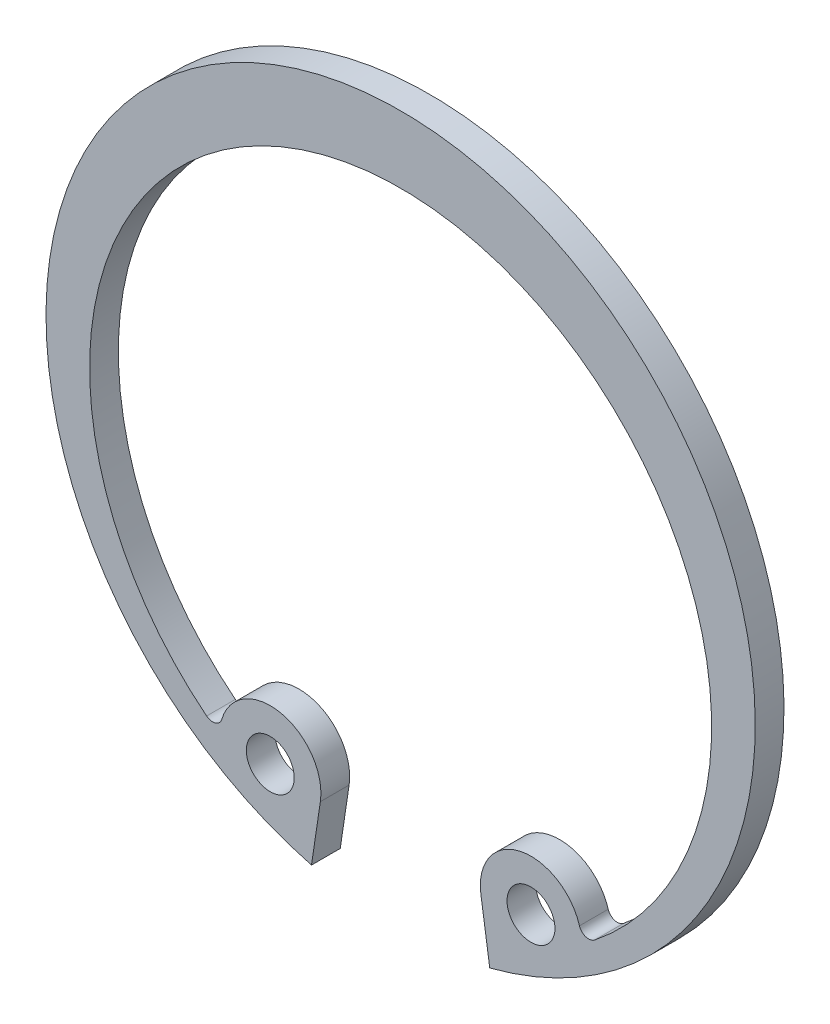
ISO-10303-21;
HEADER;
FILE_DESCRIPTION(('STEP AP214'),'2;1');
FILE_NAME('part.step','',(''),(''),'','','');
FILE_SCHEMA(('AUTOMOTIVE_DESIGN { 1 0 10303 214 1 1 1 1 }'));
ENDSEC;
DATA;
#1=APPLICATION_CONTEXT('core data for automotive mechanical design processes');
#2=APPLICATION_PROTOCOL_DEFINITION('international standard','automotive_design',2000,#1);
#3=PRODUCT_CONTEXT('',#1,'mechanical');
#4=PRODUCT('Part','Part','',(#3));
#5=PRODUCT_RELATED_PRODUCT_CATEGORY('part','',(#4));
#6=PRODUCT_DEFINITION_FORMATION('','',#4);
#7=PRODUCT_DEFINITION_CONTEXT('part definition',#1,'design');
#8=PRODUCT_DEFINITION('design','',#6,#7);
#9=PRODUCT_DEFINITION_SHAPE('','',#8);
#10=(LENGTH_UNIT() NAMED_UNIT(*) SI_UNIT(.MILLI.,.METRE.));
#11=(NAMED_UNIT(*) PLANE_ANGLE_UNIT() SI_UNIT($,.RADIAN.));
#12=(NAMED_UNIT(*) SI_UNIT($,.STERADIAN.) SOLID_ANGLE_UNIT());
#13=UNCERTAINTY_MEASURE_WITH_UNIT(LENGTH_MEASURE(1.E-05),#10,'distance_accuracy_value','');
#14=(GEOMETRIC_REPRESENTATION_CONTEXT(3) GLOBAL_UNCERTAINTY_ASSIGNED_CONTEXT((#13)) GLOBAL_UNIT_ASSIGNED_CONTEXT((#10,
#11,#12)) REPRESENTATION_CONTEXT('',''));
#15=CARTESIAN_POINT('',(0.,0.,0.));
#16=DIRECTION('',(0.,0.,1.));
#17=DIRECTION('',(1.,0.,0.));
#18=AXIS2_PLACEMENT_3D('',#15,#16,#17);
#19=CARTESIAN_POINT('',(-6.8,-14.4188102580849,1.5));
#20=DIRECTION('',(0.,0.,1.));
#21=DIRECTION('',(1.,0.,0.));
#22=AXIS2_PLACEMENT_3D('',#19,#20,#21);
#23=PLANE('',#22);
#24=CARTESIAN_POINT('',(-6.8,-14.4188102580849,1.5));
#25=DIRECTION('',(0.,0.,1.));
#26=DIRECTION('',(1.,0.,0.));
#27=AXIS2_PLACEMENT_3D('',#24,#25,#26);
#28=CIRCLE('',#27,1.25);
#29=CARTESIAN_POINT('',(-5.55,-14.4188102580849,1.5));
#30=VERTEX_POINT('',#29);
#31=EDGE_CURVE('E134',#30,#30,#28,.T.);
#32=ORIENTED_EDGE('',*,*,#31,.F.);
#33=EDGE_LOOP('',(#32));
#34=FACE_BOUND('',#33,.T.);
#35=CARTESIAN_POINT('',(-6.8,-14.4188102580849,1.5));
#36=DIRECTION('',(0.,0.,1.));
#37=DIRECTION('',(1.,0.,0.));
#38=AXIS2_PLACEMENT_3D('',#35,#36,#37);
#39=CIRCLE('',#38,2.64183456377138);
#40=CARTESIAN_POINT('',(-4.1871837080523,-14.8092982692578,1.5));
#41=VERTEX_POINT('',#40);
#42=CARTESIAN_POINT('',(-9.33028351823571,-13.6592346004433,1.5));
#43=VERTEX_POINT('',#42);
#44=EDGE_CURVE('E145',#41,#43,#39,.T.);
#45=ORIENTED_EDGE('',*,*,#44,.T.);
#46=CARTESIAN_POINT('',(-9.80917109752144,-13.5154754741039,1.5));
#47=DIRECTION('',(0.,0.,-1.));
#48=DIRECTION('',(1.,0.,0.));
#49=AXIS2_PLACEMENT_3D('',#46,#47,#48);
#50=CIRCLE('',#49,0.500000000000001);
#51=CARTESIAN_POINT('',(-10.1210684297161,-13.9062696068258,1.5));
#52=VERTEX_POINT('',#51);
#53=EDGE_CURVE('E93',#43,#52,#50,.T.);
#54=ORIENTED_EDGE('',*,*,#53,.T.);
#55=CARTESIAN_POINT('',(0.,-1.225,1.5));
#56=DIRECTION('',(0.,0.,-1.));
#57=DIRECTION('',(1.,0.,0.));
#58=AXIS2_PLACEMENT_3D('',#55,#56,#57);
#59=CIRCLE('',#58,16.225);
#60=CARTESIAN_POINT('',(10.1210684297161,-13.9062696068258,1.5));
#61=VERTEX_POINT('',#60);
#62=EDGE_CURVE('E160',#52,#61,#59,.T.);
#63=ORIENTED_EDGE('',*,*,#62,.T.);
#64=CARTESIAN_POINT('',(9.80917109752144,-13.5154754741039,1.5));
#65=DIRECTION('',(0.,0.,-1.));
#66=DIRECTION('',(-1.,0.,0.));
#67=AXIS2_PLACEMENT_3D('',#64,#65,#66);
#68=CIRCLE('',#67,0.500000000000001);
#69=CARTESIAN_POINT('',(9.33028351823571,-13.6592346004433,1.5));
#70=VERTEX_POINT('',#69);
#71=EDGE_CURVE('E173',#61,#70,#68,.T.);
#72=ORIENTED_EDGE('',*,*,#71,.T.);
#73=CARTESIAN_POINT('',(6.8,-14.4188102580849,1.5));
#74=DIRECTION('',(0.,0.,1.));
#75=DIRECTION('',(1.,0.,0.));
#76=AXIS2_PLACEMENT_3D('',#73,#74,#75);
#77=CIRCLE('',#76,2.64183456377138);
#78=CARTESIAN_POINT('',(4.1871837080523,-14.8092982692578,1.5));
#79=VERTEX_POINT('',#78);
#80=EDGE_CURVE('E112',#70,#79,#77,.T.);
#81=ORIENTED_EDGE('',*,*,#80,.T.);
#82=DIRECTION('',(0.147809411129611,-0.989015863361917,0.));
#83=VECTOR('',#82,1.);
#84=CARTESIAN_POINT('',(4.1871837080523,-14.8092982692578,1.5));
#85=LINE('',#84,#83);
#86=CARTESIAN_POINT('',(4.64999999999999,-17.9060743883186,1.5));
#87=VERTEX_POINT('',#86);
#88=EDGE_CURVE('E106',#79,#87,#85,.T.);
#89=ORIENTED_EDGE('',*,*,#88,.T.);
#90=CARTESIAN_POINT('',(0.,0.,1.5));
#91=DIRECTION('',(0.,0.,1.));
#92=DIRECTION('',(1.,0.,0.));
#93=AXIS2_PLACEMENT_3D('',#90,#91,#92);
#94=CIRCLE('',#93,18.5);
#95=CARTESIAN_POINT('',(-4.65,-17.9060743883186,1.5));
#96=VERTEX_POINT('',#95);
#97=EDGE_CURVE('E110',#87,#96,#94,.T.);
#98=ORIENTED_EDGE('',*,*,#97,.T.);
#99=DIRECTION('',(0.147809411129611,0.989015863361917,0.));
#100=VECTOR('',#99,1.);
#101=CARTESIAN_POINT('',(-4.1871837080523,-14.8092982692578,1.5));
#102=LINE('',#101,#100);
#103=EDGE_CURVE('E50',#96,#41,#102,.T.);
#104=ORIENTED_EDGE('',*,*,#103,.T.);
#105=EDGE_LOOP('',(#45,#54,#63,#72,#81,#89,#98,#104));
#106=FACE_BOUND('',#105,.T.);
#107=CARTESIAN_POINT('',(6.8,-14.4188102580849,1.5));
#108=DIRECTION('',(0.,0.,1.));
#109=DIRECTION('',(1.,0.,0.));
#110=AXIS2_PLACEMENT_3D('',#107,#108,#109);
#111=CIRCLE('',#110,1.25);
#112=CARTESIAN_POINT('',(8.05,-14.4188102580849,1.5));
#113=VERTEX_POINT('',#112);
#114=EDGE_CURVE('E182',#113,#113,#111,.T.);
#115=ORIENTED_EDGE('',*,*,#114,.F.);
#116=EDGE_LOOP('',(#115));
#117=FACE_BOUND('',#116,.T.);
#118=ADVANCED_FACE('F33',(#34,#106,#117),#23,.T.);
#119=CARTESIAN_POINT('',(-6.8,-14.4188102580849,0.));
#120=DIRECTION('',(0.,0.,1.));
#121=DIRECTION('',(1.,0.,0.));
#122=AXIS2_PLACEMENT_3D('',#119,#120,#121);
#123=PLANE('',#122);
#124=CARTESIAN_POINT('',(-6.8,-14.4188102580849,0.));
#125=DIRECTION('',(0.,0.,1.));
#126=DIRECTION('',(1.,0.,0.));
#127=AXIS2_PLACEMENT_3D('',#124,#125,#126);
#128=CIRCLE('',#127,2.64183456377138);
#129=CARTESIAN_POINT('',(-4.1871837080523,-14.8092982692578,0.));
#130=VERTEX_POINT('',#129);
#131=CARTESIAN_POINT('',(-9.33028351823571,-13.6592346004433,0.));
#132=VERTEX_POINT('',#131);
#133=EDGE_CURVE('E130',#130,#132,#128,.T.);
#134=ORIENTED_EDGE('',*,*,#133,.F.);
#135=DIRECTION('',(0.147809411129611,0.989015863361917,0.));
#136=VECTOR('',#135,1.);
#137=CARTESIAN_POINT('',(-4.1871837080523,-14.8092982692578,0.));
#138=LINE('',#137,#136);
#139=CARTESIAN_POINT('',(-4.65,-17.9060743883186,0.));
#140=VERTEX_POINT('',#139);
#141=EDGE_CURVE('E85',#140,#130,#138,.T.);
#142=ORIENTED_EDGE('',*,*,#141,.F.);
#143=CARTESIAN_POINT('',(0.,0.,0.));
#144=DIRECTION('',(0.,0.,1.));
#145=DIRECTION('',(1.,0.,0.));
#146=AXIS2_PLACEMENT_3D('',#143,#144,#145);
#147=CIRCLE('',#146,18.5);
#148=CARTESIAN_POINT('',(4.64999999999999,-17.9060743883186,0.));
#149=VERTEX_POINT('',#148);
#150=EDGE_CURVE('E79',#149,#140,#147,.T.);
#151=ORIENTED_EDGE('',*,*,#150,.F.);
#152=DIRECTION('',(0.147809411129611,-0.989015863361917,0.));
#153=VECTOR('',#152,1.);
#154=CARTESIAN_POINT('',(4.1871837080523,-14.8092982692578,0.));
#155=LINE('',#154,#153);
#156=CARTESIAN_POINT('',(4.1871837080523,-14.8092982692578,0.));
#157=VERTEX_POINT('',#156);
#158=EDGE_CURVE('E120',#157,#149,#155,.T.);
#159=ORIENTED_EDGE('',*,*,#158,.F.);
#160=CARTESIAN_POINT('',(6.8,-14.4188102580849,0.));
#161=DIRECTION('',(0.,0.,1.));
#162=DIRECTION('',(1.,0.,0.));
#163=AXIS2_PLACEMENT_3D('',#160,#161,#162);
#164=CIRCLE('',#163,2.64183456377138);
#165=CARTESIAN_POINT('',(9.33028351823571,-13.6592346004433,0.));
#166=VERTEX_POINT('',#165);
#167=EDGE_CURVE('E140',#166,#157,#164,.T.);
#168=ORIENTED_EDGE('',*,*,#167,.F.);
#169=CARTESIAN_POINT('',(9.80917109752144,-13.5154754741039,0.));
#170=DIRECTION('',(0.,0.,-1.));
#171=DIRECTION('',(-1.,0.,0.));
#172=AXIS2_PLACEMENT_3D('',#169,#170,#171);
#173=CIRCLE('',#172,0.500000000000001);
#174=CARTESIAN_POINT('',(10.1210684297161,-13.9062696068258,0.));
#175=VERTEX_POINT('',#174);
#176=EDGE_CURVE('E138',#175,#166,#173,.T.);
#177=ORIENTED_EDGE('',*,*,#176,.F.);
#178=CARTESIAN_POINT('',(0.,-1.225,0.));
#179=DIRECTION('',(0.,0.,-1.));
#180=DIRECTION('',(1.,0.,0.));
#181=AXIS2_PLACEMENT_3D('',#178,#179,#180);
#182=CIRCLE('',#181,16.225);
#183=CARTESIAN_POINT('',(-10.1210684297161,-13.9062696068258,0.));
#184=VERTEX_POINT('',#183);
#185=EDGE_CURVE('E136',#184,#175,#182,.T.);
#186=ORIENTED_EDGE('',*,*,#185,.F.);
#187=CARTESIAN_POINT('',(-9.80917109752144,-13.5154754741039,0.));
#188=DIRECTION('',(0.,0.,-1.));
#189=DIRECTION('',(1.,0.,0.));
#190=AXIS2_PLACEMENT_3D('',#187,#188,#189);
#191=CIRCLE('',#190,0.500000000000001);
#192=EDGE_CURVE('E133',#132,#184,#191,.T.);
#193=ORIENTED_EDGE('',*,*,#192,.F.);
#194=EDGE_LOOP('',(#134,#142,#151,#159,#168,#177,#186,#193));
#195=FACE_BOUND('',#194,.T.);
#196=CARTESIAN_POINT('',(-6.8,-14.4188102580849,0.));
#197=DIRECTION('',(0.,0.,1.));
#198=DIRECTION('',(1.,0.,0.));
#199=AXIS2_PLACEMENT_3D('',#196,#197,#198);
#200=CIRCLE('',#199,1.25);
#201=CARTESIAN_POINT('',(-5.55,-14.4188102580849,0.));
#202=VERTEX_POINT('',#201);
#203=EDGE_CURVE('E179',#202,#202,#200,.T.);
#204=ORIENTED_EDGE('',*,*,#203,.T.);
#205=EDGE_LOOP('',(#204));
#206=FACE_BOUND('',#205,.T.);
#207=CARTESIAN_POINT('',(6.8,-14.4188102580849,0.));
#208=DIRECTION('',(0.,0.,1.));
#209=DIRECTION('',(1.,0.,0.));
#210=AXIS2_PLACEMENT_3D('',#207,#208,#209);
#211=CIRCLE('',#210,1.25);
#212=CARTESIAN_POINT('',(8.05,-14.4188102580849,0.));
#213=VERTEX_POINT('',#212);
#214=EDGE_CURVE('E185',#213,#213,#211,.T.);
#215=ORIENTED_EDGE('',*,*,#214,.T.);
#216=EDGE_LOOP('',(#215));
#217=FACE_BOUND('',#216,.T.);
#218=ADVANCED_FACE('F164',(#195,#206,#217),#123,.F.);
#219=CARTESIAN_POINT('',(-6.8,-14.4188102580849,1.5));
#220=DIRECTION('',(0.,0.,-1.));
#221=DIRECTION('',(-1.,0.,0.));
#222=AXIS2_PLACEMENT_3D('',#219,#220,#221);
#223=CYLINDRICAL_SURFACE('',#222,2.64183456377138);
#224=ORIENTED_EDGE('',*,*,#133,.T.);
#225=DIRECTION('',(0.,0.,-1.));
#226=VECTOR('',#225,1.);
#227=CARTESIAN_POINT('',(-9.33028351823571,-13.6592346004433,1.5));
#228=LINE('',#227,#226);
#229=EDGE_CURVE('E11',#43,#132,#228,.T.);
#230=ORIENTED_EDGE('',*,*,#229,.F.);
#231=ORIENTED_EDGE('',*,*,#44,.F.);
#232=DIRECTION('',(0.,0.,-1.));
#233=VECTOR('',#232,1.);
#234=CARTESIAN_POINT('',(-4.1871837080523,-14.8092982692578,1.5));
#235=LINE('',#234,#233);
#236=EDGE_CURVE('E126',#41,#130,#235,.T.);
#237=ORIENTED_EDGE('',*,*,#236,.T.);
#238=EDGE_LOOP('',(#224,#230,#231,#237));
#239=FACE_BOUND('',#238,.T.);
#240=ADVANCED_FACE('F35',(#239),#223,.T.);
#241=CARTESIAN_POINT('',(-9.80917109752144,-13.5154754741039,1.5));
#242=DIRECTION('',(0.,0.,-1.));
#243=DIRECTION('',(-1.,0.,0.));
#244=AXIS2_PLACEMENT_3D('',#241,#242,#243);
#245=CYLINDRICAL_SURFACE('',#244,0.500000000000001);
#246=ORIENTED_EDGE('',*,*,#192,.T.);
#247=DIRECTION('',(0.,0.,-1.));
#248=VECTOR('',#247,1.);
#249=CARTESIAN_POINT('',(-10.1210684297161,-13.9062696068258,1.5));
#250=LINE('',#249,#248);
#251=EDGE_CURVE('E42',#52,#184,#250,.T.);
#252=ORIENTED_EDGE('',*,*,#251,.F.);
#253=ORIENTED_EDGE('',*,*,#53,.F.);
#254=ORIENTED_EDGE('',*,*,#229,.T.);
#255=EDGE_LOOP('',(#246,#252,#253,#254));
#256=FACE_BOUND('',#255,.T.);
#257=ADVANCED_FACE('F217',(#256),#245,.F.);
#258=CARTESIAN_POINT('',(0.,-1.225,1.5));
#259=DIRECTION('',(0.,0.,-1.));
#260=DIRECTION('',(-1.,0.,0.));
#261=AXIS2_PLACEMENT_3D('',#258,#259,#260);
#262=CYLINDRICAL_SURFACE('',#261,16.225);
#263=ORIENTED_EDGE('',*,*,#185,.T.);
#264=DIRECTION('',(0.,0.,-1.));
#265=VECTOR('',#264,1.);
#266=CARTESIAN_POINT('',(10.1210684297161,-13.9062696068258,1.5));
#267=LINE('',#266,#265);
#268=EDGE_CURVE('E152',#61,#175,#267,.T.);
#269=ORIENTED_EDGE('',*,*,#268,.F.);
#270=ORIENTED_EDGE('',*,*,#62,.F.);
#271=ORIENTED_EDGE('',*,*,#251,.T.);
#272=EDGE_LOOP('',(#263,#269,#270,#271));
#273=FACE_BOUND('',#272,.T.);
#274=ADVANCED_FACE('F158',(#273),#262,.F.);
#275=CARTESIAN_POINT('',(9.80917109752144,-13.5154754741039,1.5));
#276=DIRECTION('',(0.,0.,-1.));
#277=DIRECTION('',(-1.,0.,0.));
#278=AXIS2_PLACEMENT_3D('',#275,#276,#277);
#279=CYLINDRICAL_SURFACE('',#278,0.500000000000001);
#280=ORIENTED_EDGE('',*,*,#176,.T.);
#281=DIRECTION('',(0.,0.,-1.));
#282=VECTOR('',#281,1.);
#283=CARTESIAN_POINT('',(9.33028351823571,-13.6592346004433,1.5));
#284=LINE('',#283,#282);
#285=EDGE_CURVE('E149',#70,#166,#284,.T.);
#286=ORIENTED_EDGE('',*,*,#285,.F.);
#287=ORIENTED_EDGE('',*,*,#71,.F.);
#288=ORIENTED_EDGE('',*,*,#268,.T.);
#289=EDGE_LOOP('',(#280,#286,#287,#288));
#290=FACE_BOUND('',#289,.T.);
#291=ADVANCED_FACE('F169',(#290),#279,.F.);
#292=CARTESIAN_POINT('',(6.8,-14.4188102580849,1.5));
#293=DIRECTION('',(0.,0.,-1.));
#294=DIRECTION('',(-1.,0.,0.));
#295=AXIS2_PLACEMENT_3D('',#292,#293,#294);
#296=CYLINDRICAL_SURFACE('',#295,2.64183456377138);
#297=ORIENTED_EDGE('',*,*,#167,.T.);
#298=DIRECTION('',(0.,0.,-1.));
#299=VECTOR('',#298,1.);
#300=CARTESIAN_POINT('',(4.1871837080523,-14.8092982692578,1.5));
#301=LINE('',#300,#299);
#302=EDGE_CURVE('E121',#79,#157,#301,.T.);
#303=ORIENTED_EDGE('',*,*,#302,.F.);
#304=ORIENTED_EDGE('',*,*,#80,.F.);
#305=ORIENTED_EDGE('',*,*,#285,.T.);
#306=EDGE_LOOP('',(#297,#303,#304,#305));
#307=FACE_BOUND('',#306,.T.);
#308=ADVANCED_FACE('F172',(#307),#296,.T.);
#309=CARTESIAN_POINT('',(4.1871837080523,-14.8092982692578,1.5));
#310=DIRECTION('',(0.989015863361917,0.147809411129611,0.));
#311=DIRECTION('',(-0.147809411129611,0.989015863361917,0.));
#312=AXIS2_PLACEMENT_3D('',#309,#310,#311);
#313=PLANE('',#312);
#314=ORIENTED_EDGE('',*,*,#158,.T.);
#315=DIRECTION('',(0.,0.,-1.));
#316=VECTOR('',#315,1.);
#317=CARTESIAN_POINT('',(4.64999999999999,-17.9060743883186,1.5));
#318=LINE('',#317,#316);
#319=EDGE_CURVE('E117',#87,#149,#318,.T.);
#320=ORIENTED_EDGE('',*,*,#319,.F.);
#321=ORIENTED_EDGE('',*,*,#88,.F.);
#322=ORIENTED_EDGE('',*,*,#302,.T.);
#323=EDGE_LOOP('',(#314,#320,#321,#322));
#324=FACE_BOUND('',#323,.T.);
#325=ADVANCED_FACE('F118',(#324),#313,.F.);
#326=CARTESIAN_POINT('',(0.,0.,1.5));
#327=DIRECTION('',(0.,0.,-1.));
#328=DIRECTION('',(-1.,0.,0.));
#329=AXIS2_PLACEMENT_3D('',#326,#327,#328);
#330=CYLINDRICAL_SURFACE('',#329,18.5);
#331=ORIENTED_EDGE('',*,*,#150,.T.);
#332=DIRECTION('',(0.,0.,-1.));
#333=VECTOR('',#332,1.);
#334=CARTESIAN_POINT('',(-4.65,-17.9060743883186,1.5));
#335=LINE('',#334,#333);
#336=EDGE_CURVE('E122',#96,#140,#335,.T.);
#337=ORIENTED_EDGE('',*,*,#336,.F.);
#338=ORIENTED_EDGE('',*,*,#97,.F.);
#339=ORIENTED_EDGE('',*,*,#319,.T.);
#340=EDGE_LOOP('',(#331,#337,#338,#339));
#341=FACE_BOUND('',#340,.T.);
#342=ADVANCED_FACE('F124',(#341),#330,.T.);
#343=CARTESIAN_POINT('',(-4.1871837080523,-14.8092982692578,1.5));
#344=DIRECTION('',(-0.989015863361917,0.147809411129611,0.));
#345=DIRECTION('',(-0.147809411129611,-0.989015863361917,0.));
#346=AXIS2_PLACEMENT_3D('',#343,#344,#345);
#347=PLANE('',#346);
#348=ORIENTED_EDGE('',*,*,#141,.T.);
#349=ORIENTED_EDGE('',*,*,#236,.F.);
#350=ORIENTED_EDGE('',*,*,#103,.F.);
#351=ORIENTED_EDGE('',*,*,#336,.T.);
#352=EDGE_LOOP('',(#348,#349,#350,#351));
#353=FACE_BOUND('',#352,.T.);
#354=ADVANCED_FACE('F205',(#353),#347,.F.);
#355=CARTESIAN_POINT('',(-6.8,-14.4188102580849,1.5));
#356=DIRECTION('',(0.,0.,-1.));
#357=DIRECTION('',(-1.,0.,0.));
#358=AXIS2_PLACEMENT_3D('',#355,#356,#357);
#359=CYLINDRICAL_SURFACE('',#358,1.25);
#360=ORIENTED_EDGE('',*,*,#31,.T.);
#361=EDGE_LOOP('',(#360));
#362=FACE_BOUND('',#361,.T.);
#363=ORIENTED_EDGE('',*,*,#203,.F.);
#364=EDGE_LOOP('',(#363));
#365=FACE_BOUND('',#364,.T.);
#366=ADVANCED_FACE('F202',(#362,#365),#359,.F.);
#367=CARTESIAN_POINT('',(6.8,-14.4188102580849,1.5));
#368=DIRECTION('',(0.,0.,-1.));
#369=DIRECTION('',(-1.,0.,0.));
#370=AXIS2_PLACEMENT_3D('',#367,#368,#369);
#371=CYLINDRICAL_SURFACE('',#370,1.25);
#372=ORIENTED_EDGE('',*,*,#114,.T.);
#373=EDGE_LOOP('',(#372));
#374=FACE_BOUND('',#373,.T.);
#375=ORIENTED_EDGE('',*,*,#214,.F.);
#376=EDGE_LOOP('',(#375));
#377=FACE_BOUND('',#376,.T.);
#378=ADVANCED_FACE('F191',(#374,#377),#371,.F.);
#379=CLOSED_SHELL('',(#118,#218,#240,#257,#274,#291,#308,#325,#342,#354,#366,#378));
#380=MANIFOLD_SOLID_BREP('B2',#379);
#381=ADVANCED_BREP_SHAPE_REPRESENTATION('',(#18,#380),#14);
#382=SHAPE_DEFINITION_REPRESENTATION(#9,#381);
ENDSEC;
END-ISO-10303-21;
